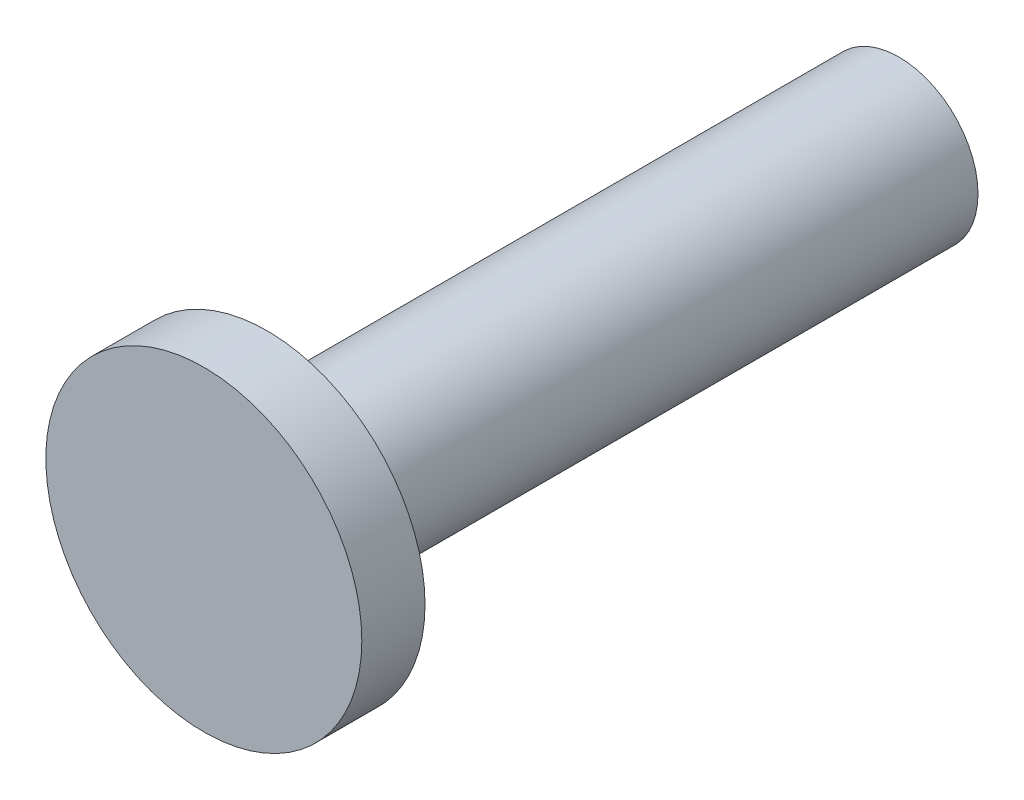
ISO-10303-21;
HEADER;
FILE_DESCRIPTION(('STEP AP214'),'2;1');
FILE_NAME('part.step','',(''),(''),'','','');
FILE_SCHEMA(('AUTOMOTIVE_DESIGN { 1 0 10303 214 1 1 1 1 }'));
ENDSEC;
DATA;
#1=APPLICATION_CONTEXT('core data for automotive mechanical design processes');
#2=APPLICATION_PROTOCOL_DEFINITION('international standard','automotive_design',2000,#1);
#3=PRODUCT_CONTEXT('',#1,'mechanical');
#4=PRODUCT('Part','Part','',(#3));
#5=PRODUCT_RELATED_PRODUCT_CATEGORY('part','',(#4));
#6=PRODUCT_DEFINITION_FORMATION('','',#4);
#7=PRODUCT_DEFINITION_CONTEXT('part definition',#1,'design');
#8=PRODUCT_DEFINITION('design','',#6,#7);
#9=PRODUCT_DEFINITION_SHAPE('','',#8);
#10=(LENGTH_UNIT() NAMED_UNIT(*) SI_UNIT(.MILLI.,.METRE.));
#11=(NAMED_UNIT(*) PLANE_ANGLE_UNIT() SI_UNIT($,.RADIAN.));
#12=(NAMED_UNIT(*) SI_UNIT($,.STERADIAN.) SOLID_ANGLE_UNIT());
#13=UNCERTAINTY_MEASURE_WITH_UNIT(LENGTH_MEASURE(1.E-05),#10,'distance_accuracy_value','');
#14=(GEOMETRIC_REPRESENTATION_CONTEXT(3) GLOBAL_UNCERTAINTY_ASSIGNED_CONTEXT((#13)) GLOBAL_UNIT_ASSIGNED_CONTEXT((#10,
#11,#12)) REPRESENTATION_CONTEXT('',''));
#15=CARTESIAN_POINT('',(0.,0.,0.));
#16=DIRECTION('',(0.,0.,1.));
#17=DIRECTION('',(1.,0.,0.));
#18=AXIS2_PLACEMENT_3D('',#15,#16,#17);
#19=CARTESIAN_POINT('',(-16.5310067338914,16.8127852577645,25.4));
#20=DIRECTION('',(0.,0.,-1.));
#21=DIRECTION('',(-1.,0.,0.));
#22=AXIS2_PLACEMENT_3D('',#19,#20,#21);
#23=CYLINDRICAL_SURFACE('',#22,3.175);
#24=CARTESIAN_POINT('',(-16.5310067338914,16.8127852577645,25.4));
#25=DIRECTION('',(0.,0.,1.));
#26=DIRECTION('',(1.,0.,0.));
#27=AXIS2_PLACEMENT_3D('',#24,#25,#26);
#28=CIRCLE('',#27,3.175);
#29=CARTESIAN_POINT('',(-13.3560067338914,16.8127852577645,25.4));
#30=VERTEX_POINT('',#29);
#31=EDGE_CURVE('E10',#30,#30,#28,.T.);
#32=ORIENTED_EDGE('',*,*,#31,.F.);
#33=EDGE_LOOP('',(#32));
#34=FACE_BOUND('',#33,.T.);
#35=CARTESIAN_POINT('',(-16.5310067338914,16.8127852577645,0.));
#36=DIRECTION('',(0.,0.,1.));
#37=DIRECTION('',(1.,0.,0.));
#38=AXIS2_PLACEMENT_3D('',#35,#36,#37);
#39=CIRCLE('',#38,3.175);
#40=CARTESIAN_POINT('',(-13.3560067338914,16.8127852577645,0.));
#41=VERTEX_POINT('',#40);
#42=EDGE_CURVE('E38',#41,#41,#39,.T.);
#43=ORIENTED_EDGE('',*,*,#42,.T.);
#44=EDGE_LOOP('',(#43));
#45=FACE_BOUND('',#44,.T.);
#46=ADVANCED_FACE('F35',(#34,#45),#23,.T.);
#47=CARTESIAN_POINT('',(-16.5310067338914,16.8127852577645,0.));
#48=DIRECTION('',(0.,0.,1.));
#49=DIRECTION('',(1.,0.,0.));
#50=AXIS2_PLACEMENT_3D('',#47,#48,#49);
#51=PLANE('',#50);
#52=ORIENTED_EDGE('',*,*,#42,.F.);
#53=EDGE_LOOP('',(#52));
#54=FACE_BOUND('',#53,.T.);
#55=ADVANCED_FACE('F58',(#54),#51,.F.);
#56=CARTESIAN_POINT('',(-16.5310058,16.8127934,27.94));
#57=DIRECTION('',(0.,0.,-1.));
#58=DIRECTION('',(-1.,0.,0.));
#59=AXIS2_PLACEMENT_3D('',#56,#57,#58);
#60=CYLINDRICAL_SURFACE('',#59,6.35);
#61=CARTESIAN_POINT('',(-16.5310058,16.8127934,27.94));
#62=DIRECTION('',(0.,0.,1.));
#63=DIRECTION('',(1.,0.,0.));
#64=AXIS2_PLACEMENT_3D('',#61,#62,#63);
#65=CIRCLE('',#64,6.35);
#66=CARTESIAN_POINT('',(-10.1810058,16.8127934,27.94));
#67=VERTEX_POINT('',#66);
#68=EDGE_CURVE('E45',#67,#67,#65,.T.);
#69=ORIENTED_EDGE('',*,*,#68,.F.);
#70=EDGE_LOOP('',(#69));
#71=FACE_BOUND('',#70,.T.);
#72=CARTESIAN_POINT('',(-16.5310058,16.8127934,25.4));
#73=DIRECTION('',(0.,0.,1.));
#74=DIRECTION('',(1.,0.,0.));
#75=AXIS2_PLACEMENT_3D('',#72,#73,#74);
#76=CIRCLE('',#75,6.35);
#77=CARTESIAN_POINT('',(-10.1810058,16.8127934,25.4));
#78=VERTEX_POINT('',#77);
#79=EDGE_CURVE('E47',#78,#78,#76,.T.);
#80=ORIENTED_EDGE('',*,*,#79,.T.);
#81=EDGE_LOOP('',(#80));
#82=FACE_BOUND('',#81,.T.);
#83=ADVANCED_FACE('F55',(#71,#82),#60,.T.);
#84=CARTESIAN_POINT('',(-16.5310058,16.8127934,27.94));
#85=DIRECTION('',(0.,0.,1.));
#86=DIRECTION('',(1.,0.,0.));
#87=AXIS2_PLACEMENT_3D('',#84,#85,#86);
#88=PLANE('',#87);
#89=ORIENTED_EDGE('',*,*,#68,.T.);
#90=EDGE_LOOP('',(#89));
#91=FACE_BOUND('',#90,.T.);
#92=ADVANCED_FACE('F53',(#91),#88,.T.);
#93=CARTESIAN_POINT('',(-16.5310058,16.8127934,25.4));
#94=DIRECTION('',(0.,0.,1.));
#95=DIRECTION('',(1.,0.,0.));
#96=AXIS2_PLACEMENT_3D('',#93,#94,#95);
#97=PLANE('',#96);
#98=ORIENTED_EDGE('',*,*,#31,.T.);
#99=EDGE_LOOP('',(#98));
#100=FACE_BOUND('',#99,.T.);
#101=ORIENTED_EDGE('',*,*,#79,.F.);
#102=EDGE_LOOP('',(#101));
#103=FACE_BOUND('',#102,.T.);
#104=ADVANCED_FACE('F62',(#100,#103),#97,.F.);
#105=CLOSED_SHELL('',(#46,#55,#83,#92,#104));
#106=MANIFOLD_SOLID_BREP('B2',#105);
#107=ADVANCED_BREP_SHAPE_REPRESENTATION('',(#18,#106),#14);
#108=SHAPE_DEFINITION_REPRESENTATION(#9,#107);
ENDSEC;
END-ISO-10303-21;
